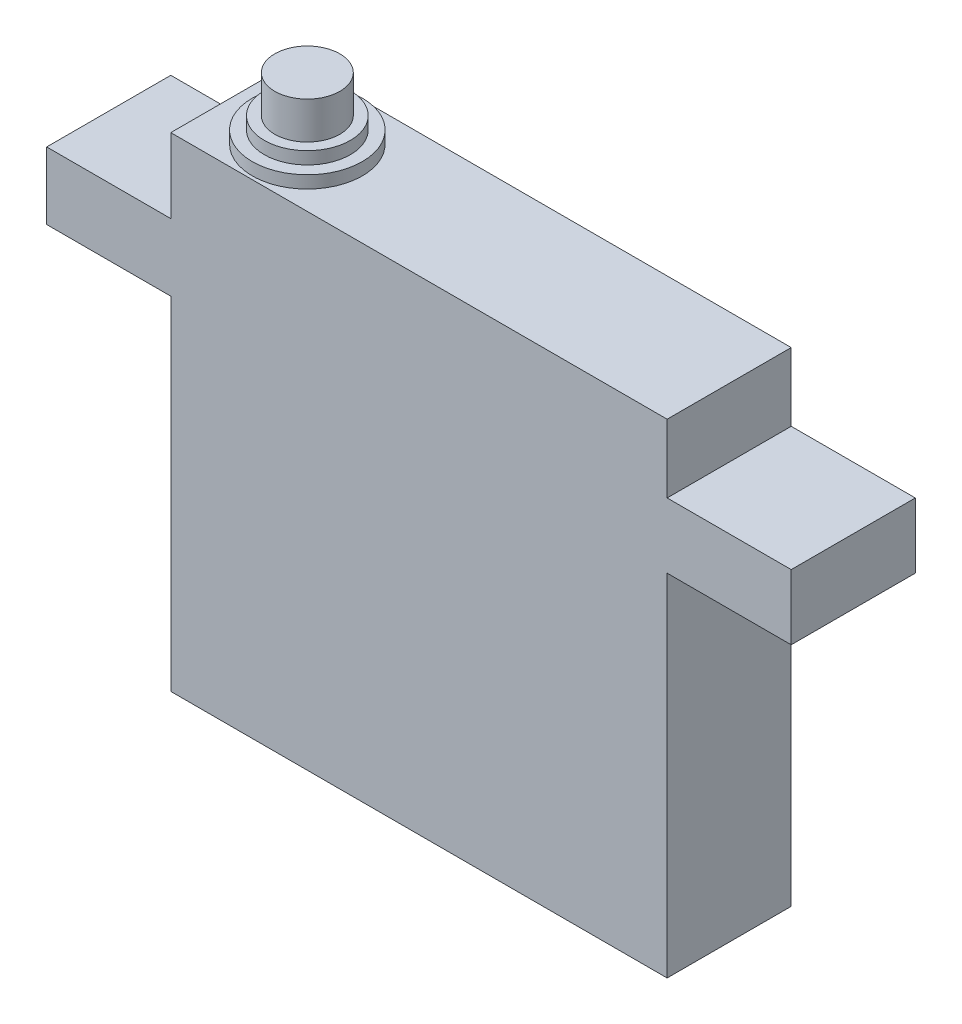
ISO-10303-21;
HEADER;
FILE_DESCRIPTION(('STEP AP214'),'2;1');
FILE_NAME('part.step','',(''),(''),'','','');
FILE_SCHEMA(('AUTOMOTIVE_DESIGN { 1 0 10303 214 1 1 1 1 }'));
ENDSEC;
DATA;
#1=APPLICATION_CONTEXT('core data for automotive mechanical design processes');
#2=APPLICATION_PROTOCOL_DEFINITION('international standard','automotive_design',2000,#1);
#3=PRODUCT_CONTEXT('',#1,'mechanical');
#4=PRODUCT('Part','Part','',(#3));
#5=PRODUCT_RELATED_PRODUCT_CATEGORY('part','',(#4));
#6=PRODUCT_DEFINITION_FORMATION('','',#4);
#7=PRODUCT_DEFINITION_CONTEXT('part definition',#1,'design');
#8=PRODUCT_DEFINITION('design','',#6,#7);
#9=PRODUCT_DEFINITION_SHAPE('','',#8);
#10=(LENGTH_UNIT() NAMED_UNIT(*) SI_UNIT(.MILLI.,.METRE.));
#11=(NAMED_UNIT(*) PLANE_ANGLE_UNIT() SI_UNIT($,.RADIAN.));
#12=(NAMED_UNIT(*) SI_UNIT($,.STERADIAN.) SOLID_ANGLE_UNIT());
#13=UNCERTAINTY_MEASURE_WITH_UNIT(LENGTH_MEASURE(1.E-05),#10,'distance_accuracy_value','');
#14=(GEOMETRIC_REPRESENTATION_CONTEXT(3) GLOBAL_UNCERTAINTY_ASSIGNED_CONTEXT((#13)) GLOBAL_UNIT_ASSIGNED_CONTEXT((#10,
#11,#12)) REPRESENTATION_CONTEXT('',''));
#15=CARTESIAN_POINT('',(0.,0.,0.));
#16=DIRECTION('',(0.,0.,1.));
#17=DIRECTION('',(1.,0.,0.));
#18=AXIS2_PLACEMENT_3D('',#15,#16,#17);
#19=CARTESIAN_POINT('',(7.47403061012816,-28.7985156989246,10.));
#20=DIRECTION('',(-1.,0.,0.));
#21=DIRECTION('',(0.,-1.,0.));
#22=AXIS2_PLACEMENT_3D('',#19,#20,#21);
#23=PLANE('',#22);
#24=DIRECTION('',(0.,0.,1.));
#25=VECTOR('',#24,1.);
#26=CARTESIAN_POINT('',(7.47403061012816,4.70475227493177,10.));
#27=LINE('',#26,#25);
#28=CARTESIAN_POINT('',(7.47403061012816,4.70475227493177,0.));
#29=VERTEX_POINT('',#28);
#30=CARTESIAN_POINT('',(7.47403061012816,4.70475227493177,10.));
#31=VERTEX_POINT('',#30);
#32=EDGE_CURVE('E161',#29,#31,#27,.T.);
#33=ORIENTED_EDGE('',*,*,#32,.F.);
#34=DIRECTION('',(0.,1.,0.));
#35=VECTOR('',#34,1.);
#36=CARTESIAN_POINT('',(7.47403061012816,-28.7985156989246,0.));
#37=LINE('',#36,#35);
#38=CARTESIAN_POINT('',(7.47403061012816,10.2014843010754,0.));
#39=VERTEX_POINT('',#38);
#40=EDGE_CURVE('E208',#29,#39,#37,.T.);
#41=ORIENTED_EDGE('',*,*,#40,.T.);
#42=DIRECTION('',(0.,0.,-1.));
#43=VECTOR('',#42,1.);
#44=CARTESIAN_POINT('',(7.47403061012816,10.2014843010754,10.));
#45=LINE('',#44,#43);
#46=CARTESIAN_POINT('',(7.47403061012816,10.2014843010754,10.));
#47=VERTEX_POINT('',#46);
#48=EDGE_CURVE('E235',#47,#39,#45,.T.);
#49=ORIENTED_EDGE('',*,*,#48,.F.);
#50=DIRECTION('',(0.,1.,0.));
#51=VECTOR('',#50,1.);
#52=CARTESIAN_POINT('',(7.47403061012816,-28.7985156989246,10.));
#53=LINE('',#52,#51);
#54=EDGE_CURVE('E67',#31,#47,#53,.T.);
#55=ORIENTED_EDGE('',*,*,#54,.F.);
#56=EDGE_LOOP('',(#33,#41,#49,#55));
#57=FACE_BOUND('',#56,.T.);
#58=ADVANCED_FACE('F51',(#57),#23,.F.);
#59=DIRECTION('',(0.,0.,-1.));
#60=VECTOR('',#59,1.);
#61=CARTESIAN_POINT('',(7.47403061012816,-0.544311751973488,10.));
#62=LINE('',#61,#60);
#63=CARTESIAN_POINT('',(7.47403061012816,-0.544311751973489,10.));
#64=VERTEX_POINT('',#63);
#65=CARTESIAN_POINT('',(7.47403061012816,-0.544311751973488,0.));
#66=VERTEX_POINT('',#65);
#67=EDGE_CURVE('E75',#64,#66,#62,.T.);
#68=ORIENTED_EDGE('',*,*,#67,.F.);
#69=CARTESIAN_POINT('',(7.47403061012816,-28.7985156989246,10.));
#70=VERTEX_POINT('',#69);
#71=EDGE_CURVE('E164',#70,#64,#53,.T.);
#72=ORIENTED_EDGE('',*,*,#71,.F.);
#73=DIRECTION('',(0.,0.,-1.));
#74=VECTOR('',#73,1.);
#75=CARTESIAN_POINT('',(7.47403061012816,-28.7985156989246,10.));
#76=LINE('',#75,#74);
#77=CARTESIAN_POINT('',(7.47403061012816,-28.7985156989246,0.));
#78=VERTEX_POINT('',#77);
#79=EDGE_CURVE('E218',#70,#78,#76,.T.);
#80=ORIENTED_EDGE('',*,*,#79,.T.);
#81=EDGE_CURVE('E219',#78,#66,#37,.T.);
#82=ORIENTED_EDGE('',*,*,#81,.T.);
#83=EDGE_LOOP('',(#68,#72,#80,#82));
#84=FACE_BOUND('',#83,.T.);
#85=ADVANCED_FACE('F278',(#84),#23,.F.);
#86=CARTESIAN_POINT('',(-32.5259693898718,-28.7985156989246,10.));
#87=DIRECTION('',(1.,0.,0.));
#88=DIRECTION('',(0.,0.,-1.));
#89=AXIS2_PLACEMENT_3D('',#86,#87,#88);
#90=PLANE('',#89);
#91=DIRECTION('',(0.,0.,-1.));
#92=VECTOR('',#91,1.);
#93=CARTESIAN_POINT('',(-32.5259693898718,4.20218231490889,0.));
#94=LINE('',#93,#92);
#95=CARTESIAN_POINT('',(-32.5259693898718,4.20218231490889,10.));
#96=VERTEX_POINT('',#95);
#97=CARTESIAN_POINT('',(-32.5259693898718,4.20218231490889,0.));
#98=VERTEX_POINT('',#97);
#99=EDGE_CURVE('E168',#96,#98,#94,.T.);
#100=ORIENTED_EDGE('',*,*,#99,.F.);
#101=DIRECTION('',(0.,-1.,0.));
#102=VECTOR('',#101,1.);
#103=CARTESIAN_POINT('',(-32.5259693898718,-28.7985156989246,10.));
#104=LINE('',#103,#102);
#105=CARTESIAN_POINT('',(-32.5259693898718,10.2014843010754,10.));
#106=VERTEX_POINT('',#105);
#107=EDGE_CURVE('E213',#106,#96,#104,.T.);
#108=ORIENTED_EDGE('',*,*,#107,.F.);
#109=DIRECTION('',(0.,0.,-1.));
#110=VECTOR('',#109,1.);
#111=CARTESIAN_POINT('',(-32.5259693898718,10.2014843010754,10.));
#112=LINE('',#111,#110);
#113=CARTESIAN_POINT('',(-32.5259693898718,10.2014843010754,0.));
#114=VERTEX_POINT('',#113);
#115=EDGE_CURVE('E233',#106,#114,#112,.T.);
#116=ORIENTED_EDGE('',*,*,#115,.T.);
#117=DIRECTION('',(0.,-1.,0.));
#118=VECTOR('',#117,1.);
#119=CARTESIAN_POINT('',(-32.5259693898718,-28.7985156989246,0.));
#120=LINE('',#119,#118);
#121=EDGE_CURVE('E224',#114,#98,#120,.T.);
#122=ORIENTED_EDGE('',*,*,#121,.T.);
#123=EDGE_LOOP('',(#100,#108,#116,#122));
#124=FACE_BOUND('',#123,.T.);
#125=ADVANCED_FACE('F255',(#124),#90,.F.);
#126=DIRECTION('',(0.,0.,1.));
#127=VECTOR('',#126,1.);
#128=CARTESIAN_POINT('',(-32.5259693898718,-1.21440503200398,0.));
#129=LINE('',#128,#127);
#130=CARTESIAN_POINT('',(-32.5259693898718,-1.21440503200397,0.));
#131=VERTEX_POINT('',#130);
#132=CARTESIAN_POINT('',(-32.5259693898718,-1.21440503200398,10.));
#133=VERTEX_POINT('',#132);
#134=EDGE_CURVE('E165',#131,#133,#129,.T.);
#135=ORIENTED_EDGE('',*,*,#134,.F.);
#136=CARTESIAN_POINT('',(-32.5259693898718,-28.7985156989246,0.));
#137=VERTEX_POINT('',#136);
#138=EDGE_CURVE('E223',#131,#137,#120,.T.);
#139=ORIENTED_EDGE('',*,*,#138,.T.);
#140=DIRECTION('',(0.,0.,-1.));
#141=VECTOR('',#140,1.);
#142=CARTESIAN_POINT('',(-32.5259693898718,-28.7985156989246,10.));
#143=LINE('',#142,#141);
#144=CARTESIAN_POINT('',(-32.5259693898718,-28.7985156989246,10.));
#145=VERTEX_POINT('',#144);
#146=EDGE_CURVE('E230',#145,#137,#143,.T.);
#147=ORIENTED_EDGE('',*,*,#146,.F.);
#148=EDGE_CURVE('E212',#133,#145,#104,.T.);
#149=ORIENTED_EDGE('',*,*,#148,.F.);
#150=EDGE_LOOP('',(#135,#139,#147,#149));
#151=FACE_BOUND('',#150,.T.);
#152=ADVANCED_FACE('F247',(#151),#90,.F.);
#153=CARTESIAN_POINT('',(-32.5259693898718,10.2014843010754,10.));
#154=DIRECTION('',(0.,-1.,0.));
#155=DIRECTION('',(0.,0.,-1.));
#156=AXIS2_PLACEMENT_3D('',#153,#154,#155);
#157=PLANE('',#156);
#158=CARTESIAN_POINT('',(-26.2162704588137,10.2014843010754,5.30611192164453));
#159=DIRECTION('',(0.,-1.,0.));
#160=DIRECTION('',(0.,0.,-1.));
#161=AXIS2_PLACEMENT_3D('',#158,#159,#160);
#162=CIRCLE('',#161,4.43267627733647);
#163=CARTESIAN_POINT('',(-26.2162704588137,10.2014843010754,0.873435644308061));
#164=VERTEX_POINT('',#163);
#165=EDGE_CURVE('E54',#164,#164,#162,.F.);
#166=ORIENTED_EDGE('',*,*,#165,.F.);
#167=EDGE_LOOP('',(#166));
#168=FACE_BOUND('',#167,.T.);
#169=DIRECTION('',(-1.,0.,0.));
#170=VECTOR('',#169,1.);
#171=CARTESIAN_POINT('',(-32.5259693898718,10.2014843010754,0.));
#172=LINE('',#171,#170);
#173=EDGE_CURVE('E221',#39,#114,#172,.T.);
#174=ORIENTED_EDGE('',*,*,#173,.T.);
#175=ORIENTED_EDGE('',*,*,#115,.F.);
#176=DIRECTION('',(-1.,0.,0.));
#177=VECTOR('',#176,1.);
#178=CARTESIAN_POINT('',(-32.5259693898718,10.2014843010754,10.));
#179=LINE('',#178,#177);
#180=EDGE_CURVE('E210',#47,#106,#179,.T.);
#181=ORIENTED_EDGE('',*,*,#180,.F.);
#182=ORIENTED_EDGE('',*,*,#48,.T.);
#183=EDGE_LOOP('',(#174,#175,#181,#182));
#184=FACE_BOUND('',#183,.T.);
#185=ADVANCED_FACE('F244',(#168,#184),#157,.F.);
#186=CARTESIAN_POINT('',(-32.5259693898718,-28.7985156989246,10.));
#187=DIRECTION('',(0.,1.,0.));
#188=DIRECTION('',(0.,0.,1.));
#189=AXIS2_PLACEMENT_3D('',#186,#187,#188);
#190=PLANE('',#189);
#191=DIRECTION('',(1.,0.,0.));
#192=VECTOR('',#191,1.);
#193=CARTESIAN_POINT('',(-32.5259693898718,-28.7985156989246,0.));
#194=LINE('',#193,#192);
#195=EDGE_CURVE('E226',#137,#78,#194,.T.);
#196=ORIENTED_EDGE('',*,*,#195,.T.);
#197=ORIENTED_EDGE('',*,*,#79,.F.);
#198=DIRECTION('',(1.,0.,0.));
#199=VECTOR('',#198,1.);
#200=CARTESIAN_POINT('',(-32.5259693898718,-28.7985156989246,10.));
#201=LINE('',#200,#199);
#202=EDGE_CURVE('E216',#145,#70,#201,.T.);
#203=ORIENTED_EDGE('',*,*,#202,.F.);
#204=ORIENTED_EDGE('',*,*,#146,.T.);
#205=EDGE_LOOP('',(#196,#197,#203,#204));
#206=FACE_BOUND('',#205,.T.);
#207=ADVANCED_FACE('F246',(#206),#190,.F.);
#208=CARTESIAN_POINT('',(0.,0.,10.));
#209=DIRECTION('',(0.,0.,-1.));
#210=DIRECTION('',(-1.,0.,0.));
#211=AXIS2_PLACEMENT_3D('',#208,#209,#210);
#212=PLANE('',#211);
#213=ORIENTED_EDGE('',*,*,#71,.T.);
#214=DIRECTION('',(-1.,0.,0.));
#215=VECTOR('',#214,1.);
#216=CARTESIAN_POINT('',(17.4740306101282,-0.544311751973486,10.));
#217=LINE('',#216,#215);
#218=CARTESIAN_POINT('',(17.4740306101282,-0.544311751973486,10.));
#219=VERTEX_POINT('',#218);
#220=EDGE_CURVE('E146',#219,#64,#217,.T.);
#221=ORIENTED_EDGE('',*,*,#220,.F.);
#222=DIRECTION('',(0.,-1.,0.));
#223=VECTOR('',#222,1.);
#224=CARTESIAN_POINT('',(17.4740306101282,4.70475227493177,10.));
#225=LINE('',#224,#223);
#226=CARTESIAN_POINT('',(17.4740306101282,4.70475227493177,10.));
#227=VERTEX_POINT('',#226);
#228=EDGE_CURVE('E152',#227,#219,#225,.T.);
#229=ORIENTED_EDGE('',*,*,#228,.F.);
#230=DIRECTION('',(-1.,0.,0.));
#231=VECTOR('',#230,1.);
#232=CARTESIAN_POINT('',(17.4740306101282,4.70475227493177,10.));
#233=LINE('',#232,#231);
#234=EDGE_CURVE('E270',#227,#31,#233,.T.);
#235=ORIENTED_EDGE('',*,*,#234,.T.);
#236=ORIENTED_EDGE('',*,*,#54,.T.);
#237=ORIENTED_EDGE('',*,*,#180,.T.);
#238=ORIENTED_EDGE('',*,*,#107,.T.);
#239=DIRECTION('',(1.,0.,0.));
#240=VECTOR('',#239,1.);
#241=CARTESIAN_POINT('',(-42.5259693898718,4.20218231490889,10.));
#242=LINE('',#241,#240);
#243=CARTESIAN_POINT('',(-42.5259693898718,4.20218231490889,10.));
#244=VERTEX_POINT('',#243);
#245=EDGE_CURVE('E188',#244,#96,#242,.T.);
#246=ORIENTED_EDGE('',*,*,#245,.F.);
#247=DIRECTION('',(0.,1.,0.));
#248=VECTOR('',#247,1.);
#249=CARTESIAN_POINT('',(-42.5259693898718,4.20218231490889,10.));
#250=LINE('',#249,#248);
#251=CARTESIAN_POINT('',(-42.5259693898718,-1.21440503200398,10.));
#252=VERTEX_POINT('',#251);
#253=EDGE_CURVE('E179',#252,#244,#250,.T.);
#254=ORIENTED_EDGE('',*,*,#253,.F.);
#255=DIRECTION('',(1.,0.,0.));
#256=VECTOR('',#255,1.);
#257=CARTESIAN_POINT('',(-42.5259693898718,-1.21440503200398,10.));
#258=LINE('',#257,#256);
#259=EDGE_CURVE('E191',#252,#133,#258,.T.);
#260=ORIENTED_EDGE('',*,*,#259,.T.);
#261=ORIENTED_EDGE('',*,*,#148,.T.);
#262=ORIENTED_EDGE('',*,*,#202,.T.);
#263=EDGE_LOOP('',(#213,#221,#229,#235,#236,#237,#238,#246,#254,#260,#261,#262));
#264=FACE_BOUND('',#263,.T.);
#265=ADVANCED_FACE('F163',(#264),#212,.F.);
#266=CARTESIAN_POINT('',(0.,0.,0.));
#267=DIRECTION('',(0.,0.,-1.));
#268=DIRECTION('',(-1.,0.,0.));
#269=AXIS2_PLACEMENT_3D('',#266,#267,#268);
#270=PLANE('',#269);
#271=ORIENTED_EDGE('',*,*,#81,.F.);
#272=ORIENTED_EDGE('',*,*,#195,.F.);
#273=ORIENTED_EDGE('',*,*,#138,.F.);
#274=DIRECTION('',(1.,0.,0.));
#275=VECTOR('',#274,1.);
#276=CARTESIAN_POINT('',(-42.5259693898718,-1.21440503200398,0.));
#277=LINE('',#276,#275);
#278=CARTESIAN_POINT('',(-42.5259693898718,-1.21440503200398,0.));
#279=VERTEX_POINT('',#278);
#280=EDGE_CURVE('E194',#279,#131,#277,.T.);
#281=ORIENTED_EDGE('',*,*,#280,.F.);
#282=DIRECTION('',(0.,-1.,0.));
#283=VECTOR('',#282,1.);
#284=CARTESIAN_POINT('',(-42.5259693898718,4.20218231490889,0.));
#285=LINE('',#284,#283);
#286=CARTESIAN_POINT('',(-42.5259693898718,4.20218231490889,0.));
#287=VERTEX_POINT('',#286);
#288=EDGE_CURVE('E174',#287,#279,#285,.T.);
#289=ORIENTED_EDGE('',*,*,#288,.F.);
#290=DIRECTION('',(1.,0.,0.));
#291=VECTOR('',#290,1.);
#292=CARTESIAN_POINT('',(-42.5259693898718,4.20218231490889,0.));
#293=LINE('',#292,#291);
#294=EDGE_CURVE('E182',#287,#98,#293,.T.);
#295=ORIENTED_EDGE('',*,*,#294,.T.);
#296=ORIENTED_EDGE('',*,*,#121,.F.);
#297=ORIENTED_EDGE('',*,*,#173,.F.);
#298=ORIENTED_EDGE('',*,*,#40,.F.);
#299=DIRECTION('',(-1.,0.,0.));
#300=VECTOR('',#299,1.);
#301=CARTESIAN_POINT('',(17.4740306101282,4.70475227493177,0.));
#302=LINE('',#301,#300);
#303=CARTESIAN_POINT('',(17.4740306101282,4.70475227493177,0.));
#304=VERTEX_POINT('',#303);
#305=EDGE_CURVE('E170',#304,#29,#302,.T.);
#306=ORIENTED_EDGE('',*,*,#305,.F.);
#307=DIRECTION('',(0.,1.,0.));
#308=VECTOR('',#307,1.);
#309=CARTESIAN_POINT('',(17.4740306101282,4.70475227493177,0.));
#310=LINE('',#309,#308);
#311=CARTESIAN_POINT('',(17.4740306101282,-0.544311751973486,0.));
#312=VERTEX_POINT('',#311);
#313=EDGE_CURVE('E151',#312,#304,#310,.T.);
#314=ORIENTED_EDGE('',*,*,#313,.F.);
#315=DIRECTION('',(-1.,0.,0.));
#316=VECTOR('',#315,1.);
#317=CARTESIAN_POINT('',(17.4740306101282,-0.544311751973486,0.));
#318=LINE('',#317,#316);
#319=EDGE_CURVE('E148',#312,#66,#318,.T.);
#320=ORIENTED_EDGE('',*,*,#319,.T.);
#321=EDGE_LOOP('',(#271,#272,#273,#281,#289,#295,#296,#297,#298,#306,#314,#320));
#322=FACE_BOUND('',#321,.T.);
#323=ADVANCED_FACE('F257',(#322),#270,.T.);
#324=CARTESIAN_POINT('',(-26.2162704588137,11.2014843010754,5.30611192164453));
#325=DIRECTION('',(0.,-1.,0.));
#326=DIRECTION('',(0.,0.,-1.));
#327=AXIS2_PLACEMENT_3D('',#324,#325,#326);
#328=CYLINDRICAL_SURFACE('',#327,4.43267627733647);
#329=CARTESIAN_POINT('',(-26.2162704588137,11.2014843010754,5.30611192164453));
#330=DIRECTION('',(0.,1.,0.));
#331=DIRECTION('',(0.,0.,1.));
#332=AXIS2_PLACEMENT_3D('',#329,#330,#331);
#333=CIRCLE('',#332,4.43267627733647);
#334=CARTESIAN_POINT('',(-26.2162704588137,11.2014843010754,9.738788198981));
#335=VERTEX_POINT('',#334);
#336=EDGE_CURVE('E203',#335,#335,#333,.T.);
#337=ORIENTED_EDGE('',*,*,#336,.F.);
#338=EDGE_LOOP('',(#337));
#339=FACE_BOUND('',#338,.T.);
#340=ORIENTED_EDGE('',*,*,#165,.T.);
#341=EDGE_LOOP('',(#340));
#342=FACE_BOUND('',#341,.T.);
#343=ADVANCED_FACE('F242',(#339,#342),#328,.T.);
#344=CARTESIAN_POINT('',(-26.2162704588137,11.2014843010754,5.30611192164453));
#345=DIRECTION('',(0.,1.,0.));
#346=DIRECTION('',(0.,0.,1.));
#347=AXIS2_PLACEMENT_3D('',#344,#345,#346);
#348=PLANE('',#347);
#349=CARTESIAN_POINT('',(-26.2162704588137,11.2014843010754,5.30611192164453));
#350=DIRECTION('',(0.,1.,0.));
#351=DIRECTION('',(0.,0.,1.));
#352=AXIS2_PLACEMENT_3D('',#349,#350,#351);
#353=CIRCLE('',#352,3.46940176143227);
#354=CARTESIAN_POINT('',(-26.2162704588137,11.2014843010754,8.7755136830768));
#355=VERTEX_POINT('',#354);
#356=EDGE_CURVE('E59',#355,#355,#353,.T.);
#357=ORIENTED_EDGE('',*,*,#356,.F.);
#358=EDGE_LOOP('',(#357));
#359=FACE_BOUND('',#358,.T.);
#360=ORIENTED_EDGE('',*,*,#336,.T.);
#361=EDGE_LOOP('',(#360));
#362=FACE_BOUND('',#361,.T.);
#363=ADVANCED_FACE('F317',(#359,#362),#348,.T.);
#364=CARTESIAN_POINT('',(-26.2162704588137,12.2014843010754,5.30611192164453));
#365=DIRECTION('',(0.,-1.,0.));
#366=DIRECTION('',(0.,0.,-1.));
#367=AXIS2_PLACEMENT_3D('',#364,#365,#366);
#368=CYLINDRICAL_SURFACE('',#367,3.46940176143227);
#369=CARTESIAN_POINT('',(-26.2162704588137,12.2014843010754,5.30611192164453));
#370=DIRECTION('',(0.,1.,0.));
#371=DIRECTION('',(0.,0.,1.));
#372=AXIS2_PLACEMENT_3D('',#369,#370,#371);
#373=CIRCLE('',#372,3.46940176143227);
#374=CARTESIAN_POINT('',(-26.2162704588137,12.2014843010754,8.7755136830768));
#375=VERTEX_POINT('',#374);
#376=EDGE_CURVE('E199',#375,#375,#373,.T.);
#377=ORIENTED_EDGE('',*,*,#376,.F.);
#378=EDGE_LOOP('',(#377));
#379=FACE_BOUND('',#378,.T.);
#380=ORIENTED_EDGE('',*,*,#356,.T.);
#381=EDGE_LOOP('',(#380));
#382=FACE_BOUND('',#381,.T.);
#383=ADVANCED_FACE('F321',(#379,#382),#368,.T.);
#384=CARTESIAN_POINT('',(-26.2162704588137,12.2014843010754,5.30611192164453));
#385=DIRECTION('',(0.,1.,0.));
#386=DIRECTION('',(0.,0.,1.));
#387=AXIS2_PLACEMENT_3D('',#384,#385,#386);
#388=PLANE('',#387);
#389=CARTESIAN_POINT('',(-26.2162704588137,12.2014843010754,5.30611192164453));
#390=DIRECTION('',(0.,1.,0.));
#391=DIRECTION('',(0.,0.,1.));
#392=AXIS2_PLACEMENT_3D('',#389,#390,#391);
#393=CIRCLE('',#392,2.62094621144064);
#394=CARTESIAN_POINT('',(-26.2162704588137,12.2014843010754,7.92705813308517));
#395=VERTEX_POINT('',#394);
#396=EDGE_CURVE('E13',#395,#395,#393,.T.);
#397=ORIENTED_EDGE('',*,*,#396,.F.);
#398=EDGE_LOOP('',(#397));
#399=FACE_BOUND('',#398,.T.);
#400=ORIENTED_EDGE('',*,*,#376,.T.);
#401=EDGE_LOOP('',(#400));
#402=FACE_BOUND('',#401,.T.);
#403=ADVANCED_FACE('F325',(#399,#402),#388,.T.);
#404=CARTESIAN_POINT('',(-26.2162704588137,15.2014843010754,5.30611192164453));
#405=DIRECTION('',(0.,-1.,0.));
#406=DIRECTION('',(0.,0.,-1.));
#407=AXIS2_PLACEMENT_3D('',#404,#405,#406);
#408=CYLINDRICAL_SURFACE('',#407,2.62094621144064);
#409=CARTESIAN_POINT('',(-26.2162704588137,15.2014843010754,5.30611192164453));
#410=DIRECTION('',(0.,1.,0.));
#411=DIRECTION('',(0.,0.,1.));
#412=AXIS2_PLACEMENT_3D('',#409,#410,#411);
#413=CIRCLE('',#412,2.62094621144064);
#414=CARTESIAN_POINT('',(-26.2162704588137,15.2014843010754,7.92705813308517));
#415=VERTEX_POINT('',#414);
#416=EDGE_CURVE('E197',#415,#415,#413,.T.);
#417=ORIENTED_EDGE('',*,*,#416,.F.);
#418=EDGE_LOOP('',(#417));
#419=FACE_BOUND('',#418,.T.);
#420=ORIENTED_EDGE('',*,*,#396,.T.);
#421=EDGE_LOOP('',(#420));
#422=FACE_BOUND('',#421,.T.);
#423=ADVANCED_FACE('F329',(#419,#422),#408,.T.);
#424=CARTESIAN_POINT('',(-26.2162704588137,15.2014843010754,5.30611192164453));
#425=DIRECTION('',(0.,1.,0.));
#426=DIRECTION('',(0.,0.,1.));
#427=AXIS2_PLACEMENT_3D('',#424,#425,#426);
#428=PLANE('',#427);
#429=ORIENTED_EDGE('',*,*,#416,.T.);
#430=EDGE_LOOP('',(#429));
#431=FACE_BOUND('',#430,.T.);
#432=ADVANCED_FACE('F333',(#431),#428,.T.);
#433=CARTESIAN_POINT('',(-42.5259693898718,-1.21440503200398,0.));
#434=DIRECTION('',(0.,1.,0.));
#435=DIRECTION('',(0.,0.,1.));
#436=AXIS2_PLACEMENT_3D('',#433,#434,#435);
#437=PLANE('',#436);
#438=ORIENTED_EDGE('',*,*,#134,.T.);
#439=ORIENTED_EDGE('',*,*,#259,.F.);
#440=DIRECTION('',(0.,0.,1.));
#441=VECTOR('',#440,1.);
#442=CARTESIAN_POINT('',(-42.5259693898718,-1.21440503200398,0.));
#443=LINE('',#442,#441);
#444=EDGE_CURVE('E177',#279,#252,#443,.T.);
#445=ORIENTED_EDGE('',*,*,#444,.F.);
#446=ORIENTED_EDGE('',*,*,#280,.T.);
#447=EDGE_LOOP('',(#438,#439,#445,#446));
#448=FACE_BOUND('',#447,.T.);
#449=ADVANCED_FACE('F285',(#448),#437,.F.);
#450=CARTESIAN_POINT('',(-42.5259693898718,4.20218231490889,0.));
#451=DIRECTION('',(0.,-1.,0.));
#452=DIRECTION('',(0.,0.,-1.));
#453=AXIS2_PLACEMENT_3D('',#450,#451,#452);
#454=PLANE('',#453);
#455=ORIENTED_EDGE('',*,*,#99,.T.);
#456=ORIENTED_EDGE('',*,*,#294,.F.);
#457=DIRECTION('',(0.,0.,-1.));
#458=VECTOR('',#457,1.);
#459=CARTESIAN_POINT('',(-42.5259693898718,4.20218231490889,0.));
#460=LINE('',#459,#458);
#461=EDGE_CURVE('E181',#244,#287,#460,.T.);
#462=ORIENTED_EDGE('',*,*,#461,.F.);
#463=ORIENTED_EDGE('',*,*,#245,.T.);
#464=EDGE_LOOP('',(#455,#456,#462,#463));
#465=FACE_BOUND('',#464,.T.);
#466=ADVANCED_FACE('F263',(#465),#454,.F.);
#467=CARTESIAN_POINT('',(-42.5259693898718,0.,0.));
#468=DIRECTION('',(-1.,0.,0.));
#469=DIRECTION('',(0.,0.,1.));
#470=AXIS2_PLACEMENT_3D('',#467,#468,#469);
#471=PLANE('',#470);
#472=ORIENTED_EDGE('',*,*,#288,.T.);
#473=ORIENTED_EDGE('',*,*,#444,.T.);
#474=ORIENTED_EDGE('',*,*,#253,.T.);
#475=ORIENTED_EDGE('',*,*,#461,.T.);
#476=EDGE_LOOP('',(#472,#473,#474,#475));
#477=FACE_BOUND('',#476,.T.);
#478=ADVANCED_FACE('F288',(#477),#471,.T.);
#479=CARTESIAN_POINT('',(17.4740306101282,-0.544311751973486,10.));
#480=DIRECTION('',(0.,1.,0.));
#481=DIRECTION('',(-1.,0.,0.));
#482=AXIS2_PLACEMENT_3D('',#479,#480,#481);
#483=PLANE('',#482);
#484=ORIENTED_EDGE('',*,*,#67,.T.);
#485=ORIENTED_EDGE('',*,*,#319,.F.);
#486=DIRECTION('',(0.,0.,-1.));
#487=VECTOR('',#486,1.);
#488=CARTESIAN_POINT('',(17.4740306101282,-0.544311751973486,10.));
#489=LINE('',#488,#487);
#490=EDGE_CURVE('E142',#219,#312,#489,.T.);
#491=ORIENTED_EDGE('',*,*,#490,.F.);
#492=ORIENTED_EDGE('',*,*,#220,.T.);
#493=EDGE_LOOP('',(#484,#485,#491,#492));
#494=FACE_BOUND('',#493,.T.);
#495=ADVANCED_FACE('F144',(#494),#483,.F.);
#496=CARTESIAN_POINT('',(17.4740306101282,4.70475227493177,10.));
#497=DIRECTION('',(0.,-1.,0.));
#498=DIRECTION('',(1.,0.,0.));
#499=AXIS2_PLACEMENT_3D('',#496,#497,#498);
#500=PLANE('',#499);
#501=ORIENTED_EDGE('',*,*,#32,.T.);
#502=ORIENTED_EDGE('',*,*,#234,.F.);
#503=DIRECTION('',(0.,0.,1.));
#504=VECTOR('',#503,1.);
#505=CARTESIAN_POINT('',(17.4740306101282,4.70475227493177,10.));
#506=LINE('',#505,#504);
#507=EDGE_CURVE('E157',#304,#227,#506,.T.);
#508=ORIENTED_EDGE('',*,*,#507,.F.);
#509=ORIENTED_EDGE('',*,*,#305,.T.);
#510=EDGE_LOOP('',(#501,#502,#508,#509));
#511=FACE_BOUND('',#510,.T.);
#512=ADVANCED_FACE('F269',(#511),#500,.F.);
#513=CARTESIAN_POINT('',(17.4740306101282,0.,0.));
#514=DIRECTION('',(1.,0.,0.));
#515=DIRECTION('',(0.,1.,0.));
#516=AXIS2_PLACEMENT_3D('',#513,#514,#515);
#517=PLANE('',#516);
#518=ORIENTED_EDGE('',*,*,#228,.T.);
#519=ORIENTED_EDGE('',*,*,#490,.T.);
#520=ORIENTED_EDGE('',*,*,#313,.T.);
#521=ORIENTED_EDGE('',*,*,#507,.T.);
#522=EDGE_LOOP('',(#518,#519,#520,#521));
#523=FACE_BOUND('',#522,.T.);
#524=ADVANCED_FACE('F155',(#523),#517,.T.);
#525=CLOSED_SHELL('',(#58,#85,#125,#152,#185,#207,#265,#323,#343,#363,#383,#403,#423,#432,#449,
#466,#478,#495,#512,#524));
#526=MANIFOLD_SOLID_BREP('B2',#525);
#527=ADVANCED_BREP_SHAPE_REPRESENTATION('',(#18,#526),#14);
#528=SHAPE_DEFINITION_REPRESENTATION(#9,#527);
ENDSEC;
END-ISO-10303-21;
